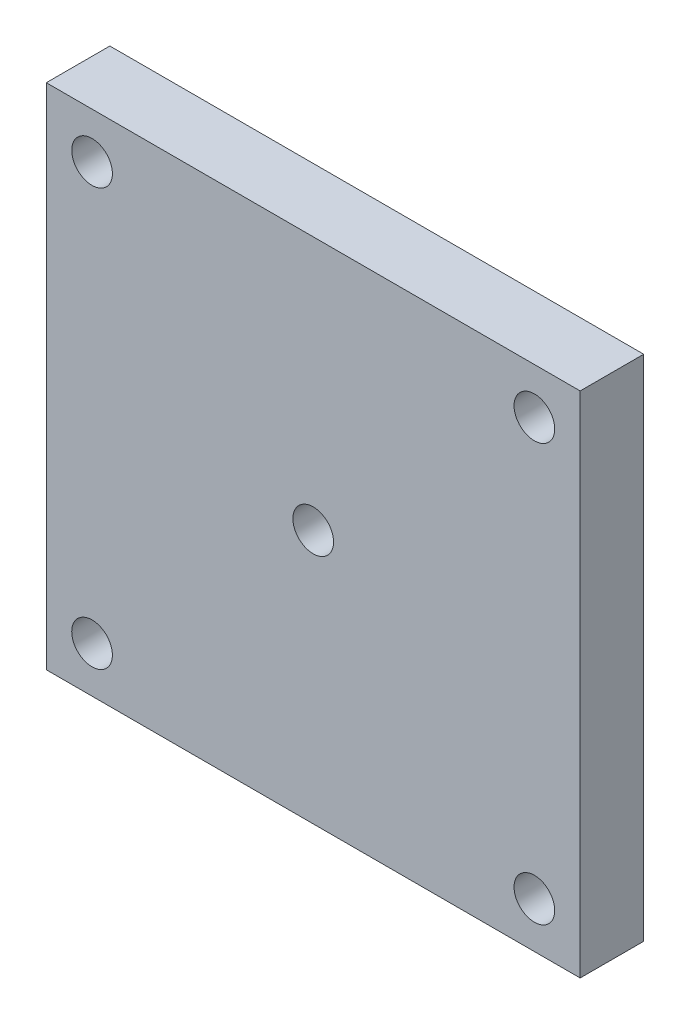
ISO-10303-21;
HEADER;
FILE_DESCRIPTION(('STEP AP214'),'2;1');
FILE_NAME('part.step','',(''),(''),'','','');
FILE_SCHEMA(('AUTOMOTIVE_DESIGN { 1 0 10303 214 1 1 1 1 }'));
ENDSEC;
DATA;
#1=APPLICATION_CONTEXT('core data for automotive mechanical design processes');
#2=APPLICATION_PROTOCOL_DEFINITION('international standard','automotive_design',2000,#1);
#3=PRODUCT_CONTEXT('',#1,'mechanical');
#4=PRODUCT('Part','Part','',(#3));
#5=PRODUCT_RELATED_PRODUCT_CATEGORY('part','',(#4));
#6=PRODUCT_DEFINITION_FORMATION('','',#4);
#7=PRODUCT_DEFINITION_CONTEXT('part definition',#1,'design');
#8=PRODUCT_DEFINITION('design','',#6,#7);
#9=PRODUCT_DEFINITION_SHAPE('','',#8);
#10=(LENGTH_UNIT() NAMED_UNIT(*) SI_UNIT(.MILLI.,.METRE.));
#11=(NAMED_UNIT(*) PLANE_ANGLE_UNIT() SI_UNIT($,.RADIAN.));
#12=(NAMED_UNIT(*) SI_UNIT($,.STERADIAN.) SOLID_ANGLE_UNIT());
#13=UNCERTAINTY_MEASURE_WITH_UNIT(LENGTH_MEASURE(1.E-05),#10,'distance_accuracy_value','');
#14=(GEOMETRIC_REPRESENTATION_CONTEXT(3) GLOBAL_UNCERTAINTY_ASSIGNED_CONTEXT((#13)) GLOBAL_UNIT_ASSIGNED_CONTEXT((#10,
#11,#12)) REPRESENTATION_CONTEXT('',''));
#15=CARTESIAN_POINT('',(0.,0.,0.));
#16=DIRECTION('',(0.,0.,1.));
#17=DIRECTION('',(1.,0.,0.));
#18=AXIS2_PLACEMENT_3D('',#15,#16,#17);
#19=CARTESIAN_POINT('',(-21.,20.,2.5));
#20=DIRECTION('',(1.,0.,0.));
#21=DIRECTION('',(0.,1.,0.));
#22=AXIS2_PLACEMENT_3D('',#19,#20,#21);
#23=PLANE('',#22);
#24=DIRECTION('',(0.,-1.,0.));
#25=VECTOR('',#24,1.);
#26=CARTESIAN_POINT('',(-21.,20.,-2.5));
#27=LINE('',#26,#25);
#28=CARTESIAN_POINT('',(-21.,20.,-2.5));
#29=VERTEX_POINT('',#28);
#30=CARTESIAN_POINT('',(-21.,-20.,-2.5));
#31=VERTEX_POINT('',#30);
#32=EDGE_CURVE('E96',#29,#31,#27,.T.);
#33=ORIENTED_EDGE('',*,*,#32,.T.);
#34=DIRECTION('',(0.,0.,-1.));
#35=VECTOR('',#34,1.);
#36=CARTESIAN_POINT('',(-21.,-20.,2.5));
#37=LINE('',#36,#35);
#38=CARTESIAN_POINT('',(-21.,-20.,2.5));
#39=VERTEX_POINT('',#38);
#40=EDGE_CURVE('E11',#39,#31,#37,.T.);
#41=ORIENTED_EDGE('',*,*,#40,.F.);
#42=DIRECTION('',(0.,-1.,0.));
#43=VECTOR('',#42,1.);
#44=CARTESIAN_POINT('',(-21.,20.,2.5));
#45=LINE('',#44,#43);
#46=CARTESIAN_POINT('',(-21.,20.,2.5));
#47=VERTEX_POINT('',#46);
#48=EDGE_CURVE('E84',#47,#39,#45,.T.);
#49=ORIENTED_EDGE('',*,*,#48,.F.);
#50=DIRECTION('',(0.,0.,-1.));
#51=VECTOR('',#50,1.);
#52=CARTESIAN_POINT('',(-21.,20.,2.5));
#53=LINE('',#52,#51);
#54=EDGE_CURVE('E92',#47,#29,#53,.T.);
#55=ORIENTED_EDGE('',*,*,#54,.T.);
#56=EDGE_LOOP('',(#33,#41,#49,#55));
#57=FACE_BOUND('',#56,.T.);
#58=ADVANCED_FACE('F33',(#57),#23,.F.);
#59=CARTESIAN_POINT('',(-21.,-20.,2.5));
#60=DIRECTION('',(0.,1.,0.));
#61=DIRECTION('',(0.,0.,1.));
#62=AXIS2_PLACEMENT_3D('',#59,#60,#61);
#63=PLANE('',#62);
#64=DIRECTION('',(1.,0.,0.));
#65=VECTOR('',#64,1.);
#66=CARTESIAN_POINT('',(-21.,-20.,-2.5));
#67=LINE('',#66,#65);
#68=CARTESIAN_POINT('',(21.,-20.,-2.5));
#69=VERTEX_POINT('',#68);
#70=EDGE_CURVE('E88',#31,#69,#67,.T.);
#71=ORIENTED_EDGE('',*,*,#70,.T.);
#72=DIRECTION('',(0.,0.,-1.));
#73=VECTOR('',#72,1.);
#74=CARTESIAN_POINT('',(21.,-20.,2.5));
#75=LINE('',#74,#73);
#76=CARTESIAN_POINT('',(21.,-20.,2.5));
#77=VERTEX_POINT('',#76);
#78=EDGE_CURVE('E41',#77,#69,#75,.T.);
#79=ORIENTED_EDGE('',*,*,#78,.F.);
#80=DIRECTION('',(1.,0.,0.));
#81=VECTOR('',#80,1.);
#82=CARTESIAN_POINT('',(-21.,-20.,2.5));
#83=LINE('',#82,#81);
#84=EDGE_CURVE('E79',#39,#77,#83,.T.);
#85=ORIENTED_EDGE('',*,*,#84,.F.);
#86=ORIENTED_EDGE('',*,*,#40,.T.);
#87=EDGE_LOOP('',(#71,#79,#85,#86));
#88=FACE_BOUND('',#87,.T.);
#89=ADVANCED_FACE('F87',(#88),#63,.F.);
#90=CARTESIAN_POINT('',(21.,20.,2.5));
#91=DIRECTION('',(-1.,0.,0.));
#92=DIRECTION('',(0.,-1.,0.));
#93=AXIS2_PLACEMENT_3D('',#90,#91,#92);
#94=PLANE('',#93);
#95=DIRECTION('',(0.,1.,0.));
#96=VECTOR('',#95,1.);
#97=CARTESIAN_POINT('',(21.,20.,-2.5));
#98=LINE('',#97,#96);
#99=CARTESIAN_POINT('',(21.,20.,-2.5));
#100=VERTEX_POINT('',#99);
#101=EDGE_CURVE('E66',#69,#100,#98,.T.);
#102=ORIENTED_EDGE('',*,*,#101,.T.);
#103=DIRECTION('',(0.,0.,-1.));
#104=VECTOR('',#103,1.);
#105=CARTESIAN_POINT('',(21.,20.,2.5));
#106=LINE('',#105,#104);
#107=CARTESIAN_POINT('',(21.,20.,2.5));
#108=VERTEX_POINT('',#107);
#109=EDGE_CURVE('E89',#108,#100,#106,.T.);
#110=ORIENTED_EDGE('',*,*,#109,.F.);
#111=DIRECTION('',(0.,1.,0.));
#112=VECTOR('',#111,1.);
#113=CARTESIAN_POINT('',(21.,20.,2.5));
#114=LINE('',#113,#112);
#115=EDGE_CURVE('E82',#77,#108,#114,.T.);
#116=ORIENTED_EDGE('',*,*,#115,.F.);
#117=ORIENTED_EDGE('',*,*,#78,.T.);
#118=EDGE_LOOP('',(#102,#110,#116,#117));
#119=FACE_BOUND('',#118,.T.);
#120=ADVANCED_FACE('F90',(#119),#94,.F.);
#121=CARTESIAN_POINT('',(-21.,20.,2.5));
#122=DIRECTION('',(0.,-1.,0.));
#123=DIRECTION('',(0.,0.,-1.));
#124=AXIS2_PLACEMENT_3D('',#121,#122,#123);
#125=PLANE('',#124);
#126=DIRECTION('',(-1.,0.,0.));
#127=VECTOR('',#126,1.);
#128=CARTESIAN_POINT('',(-21.,20.,-2.5));
#129=LINE('',#128,#127);
#130=EDGE_CURVE('E72',#100,#29,#129,.T.);
#131=ORIENTED_EDGE('',*,*,#130,.T.);
#132=ORIENTED_EDGE('',*,*,#54,.F.);
#133=DIRECTION('',(-1.,0.,0.));
#134=VECTOR('',#133,1.);
#135=CARTESIAN_POINT('',(-21.,20.,2.5));
#136=LINE('',#135,#134);
#137=EDGE_CURVE('E49',#108,#47,#136,.T.);
#138=ORIENTED_EDGE('',*,*,#137,.F.);
#139=ORIENTED_EDGE('',*,*,#109,.T.);
#140=EDGE_LOOP('',(#131,#132,#138,#139));
#141=FACE_BOUND('',#140,.T.);
#142=ADVANCED_FACE('F104',(#141),#125,.F.);
#143=CARTESIAN_POINT('',(0.,0.,2.5));
#144=DIRECTION('',(0.,0.,1.));
#145=DIRECTION('',(1.,0.,0.));
#146=AXIS2_PLACEMENT_3D('',#143,#144,#145);
#147=PLANE('',#146);
#148=CARTESIAN_POINT('',(17.4,16.4,2.5));
#149=DIRECTION('',(0.,0.,1.));
#150=DIRECTION('',(-1.,0.,0.));
#151=AXIS2_PLACEMENT_3D('',#148,#149,#150);
#152=CIRCLE('',#151,1.6);
#153=CARTESIAN_POINT('',(15.8,16.4,2.5));
#154=VERTEX_POINT('',#153);
#155=EDGE_CURVE('E134',#154,#154,#152,.T.);
#156=ORIENTED_EDGE('',*,*,#155,.F.);
#157=EDGE_LOOP('',(#156));
#158=FACE_BOUND('',#157,.T.);
#159=CARTESIAN_POINT('',(17.4,-16.4,2.5));
#160=DIRECTION('',(0.,0.,1.));
#161=DIRECTION('',(1.,0.,0.));
#162=AXIS2_PLACEMENT_3D('',#159,#160,#161);
#163=CIRCLE('',#162,1.6);
#164=CARTESIAN_POINT('',(19.,-16.4,2.5));
#165=VERTEX_POINT('',#164);
#166=EDGE_CURVE('E128',#165,#165,#163,.T.);
#167=ORIENTED_EDGE('',*,*,#166,.F.);
#168=EDGE_LOOP('',(#167));
#169=FACE_BOUND('',#168,.T.);
#170=CARTESIAN_POINT('',(-17.4,-16.4,2.5));
#171=DIRECTION('',(0.,0.,1.));
#172=DIRECTION('',(-1.,0.,0.));
#173=AXIS2_PLACEMENT_3D('',#170,#171,#172);
#174=CIRCLE('',#173,1.6);
#175=CARTESIAN_POINT('',(-19.,-16.4,2.5));
#176=VERTEX_POINT('',#175);
#177=EDGE_CURVE('E122',#176,#176,#174,.T.);
#178=ORIENTED_EDGE('',*,*,#177,.F.);
#179=EDGE_LOOP('',(#178));
#180=FACE_BOUND('',#179,.T.);
#181=CARTESIAN_POINT('',(0.,0.,2.5));
#182=DIRECTION('',(0.,0.,1.));
#183=DIRECTION('',(1.,0.,0.));
#184=AXIS2_PLACEMENT_3D('',#181,#182,#183);
#185=CIRCLE('',#184,1.6);
#186=CARTESIAN_POINT('',(1.6,0.,2.5));
#187=VERTEX_POINT('',#186);
#188=EDGE_CURVE('E116',#187,#187,#185,.T.);
#189=ORIENTED_EDGE('',*,*,#188,.F.);
#190=EDGE_LOOP('',(#189));
#191=FACE_BOUND('',#190,.T.);
#192=CARTESIAN_POINT('',(-17.4,16.4,2.5));
#193=DIRECTION('',(0.,0.,1.));
#194=DIRECTION('',(1.,0.,0.));
#195=AXIS2_PLACEMENT_3D('',#192,#193,#194);
#196=CIRCLE('',#195,1.6);
#197=CARTESIAN_POINT('',(-15.8,16.4,2.5));
#198=VERTEX_POINT('',#197);
#199=EDGE_CURVE('E110',#198,#198,#196,.T.);
#200=ORIENTED_EDGE('',*,*,#199,.F.);
#201=EDGE_LOOP('',(#200));
#202=FACE_BOUND('',#201,.T.);
#203=ORIENTED_EDGE('',*,*,#48,.T.);
#204=ORIENTED_EDGE('',*,*,#84,.T.);
#205=ORIENTED_EDGE('',*,*,#115,.T.);
#206=ORIENTED_EDGE('',*,*,#137,.T.);
#207=EDGE_LOOP('',(#203,#204,#205,#206));
#208=FACE_BOUND('',#207,.T.);
#209=ADVANCED_FACE('F80',(#158,#169,#180,#191,#202,#208),#147,.T.);
#210=CARTESIAN_POINT('',(0.,0.,-2.5));
#211=DIRECTION('',(0.,0.,1.));
#212=DIRECTION('',(1.,0.,0.));
#213=AXIS2_PLACEMENT_3D('',#210,#211,#212);
#214=PLANE('',#213);
#215=CARTESIAN_POINT('',(17.4,16.4,-2.5));
#216=DIRECTION('',(0.,0.,1.));
#217=DIRECTION('',(-1.,0.,0.));
#218=AXIS2_PLACEMENT_3D('',#215,#216,#217);
#219=CIRCLE('',#218,1.6);
#220=CARTESIAN_POINT('',(15.8,16.4,-2.5));
#221=VERTEX_POINT('',#220);
#222=EDGE_CURVE('E113',#221,#221,#219,.T.);
#223=ORIENTED_EDGE('',*,*,#222,.T.);
#224=EDGE_LOOP('',(#223));
#225=FACE_BOUND('',#224,.T.);
#226=CARTESIAN_POINT('',(17.4,-16.4,-2.5));
#227=DIRECTION('',(0.,0.,1.));
#228=DIRECTION('',(1.,0.,0.));
#229=AXIS2_PLACEMENT_3D('',#226,#227,#228);
#230=CIRCLE('',#229,1.6);
#231=CARTESIAN_POINT('',(19.,-16.4,-2.5));
#232=VERTEX_POINT('',#231);
#233=EDGE_CURVE('E131',#232,#232,#230,.T.);
#234=ORIENTED_EDGE('',*,*,#233,.T.);
#235=EDGE_LOOP('',(#234));
#236=FACE_BOUND('',#235,.T.);
#237=CARTESIAN_POINT('',(-17.4,-16.4,-2.5));
#238=DIRECTION('',(0.,0.,1.));
#239=DIRECTION('',(-1.,0.,0.));
#240=AXIS2_PLACEMENT_3D('',#237,#238,#239);
#241=CIRCLE('',#240,1.6);
#242=CARTESIAN_POINT('',(-19.,-16.4,-2.5));
#243=VERTEX_POINT('',#242);
#244=EDGE_CURVE('E125',#243,#243,#241,.T.);
#245=ORIENTED_EDGE('',*,*,#244,.T.);
#246=EDGE_LOOP('',(#245));
#247=FACE_BOUND('',#246,.T.);
#248=CARTESIAN_POINT('',(0.,0.,-2.5));
#249=DIRECTION('',(0.,0.,1.));
#250=DIRECTION('',(1.,0.,0.));
#251=AXIS2_PLACEMENT_3D('',#248,#249,#250);
#252=CIRCLE('',#251,1.6);
#253=CARTESIAN_POINT('',(1.6,0.,-2.5));
#254=VERTEX_POINT('',#253);
#255=EDGE_CURVE('E119',#254,#254,#252,.T.);
#256=ORIENTED_EDGE('',*,*,#255,.T.);
#257=EDGE_LOOP('',(#256));
#258=FACE_BOUND('',#257,.T.);
#259=CARTESIAN_POINT('',(-17.4,16.4,-2.5));
#260=DIRECTION('',(0.,0.,1.));
#261=DIRECTION('',(1.,0.,0.));
#262=AXIS2_PLACEMENT_3D('',#259,#260,#261);
#263=CIRCLE('',#262,1.6);
#264=CARTESIAN_POINT('',(-15.8,16.4,-2.5));
#265=VERTEX_POINT('',#264);
#266=EDGE_CURVE('E99',#265,#265,#263,.T.);
#267=ORIENTED_EDGE('',*,*,#266,.T.);
#268=EDGE_LOOP('',(#267));
#269=FACE_BOUND('',#268,.T.);
#270=ORIENTED_EDGE('',*,*,#32,.F.);
#271=ORIENTED_EDGE('',*,*,#130,.F.);
#272=ORIENTED_EDGE('',*,*,#101,.F.);
#273=ORIENTED_EDGE('',*,*,#70,.F.);
#274=EDGE_LOOP('',(#270,#271,#272,#273));
#275=FACE_BOUND('',#274,.T.);
#276=ADVANCED_FACE('F107',(#225,#236,#247,#258,#269,#275),#214,.F.);
#277=CARTESIAN_POINT('',(-17.4,16.4,-2.5));
#278=DIRECTION('',(0.,0.,1.));
#279=DIRECTION('',(1.,0.,0.));
#280=AXIS2_PLACEMENT_3D('',#277,#278,#279);
#281=CYLINDRICAL_SURFACE('',#280,1.6);
#282=ORIENTED_EDGE('',*,*,#266,.F.);
#283=EDGE_LOOP('',(#282));
#284=FACE_BOUND('',#283,.T.);
#285=ORIENTED_EDGE('',*,*,#199,.T.);
#286=EDGE_LOOP('',(#285));
#287=FACE_BOUND('',#286,.T.);
#288=ADVANCED_FACE('F160',(#284,#287),#281,.F.);
#289=CARTESIAN_POINT('',(0.,0.,-2.5));
#290=DIRECTION('',(0.,0.,1.));
#291=DIRECTION('',(1.,0.,0.));
#292=AXIS2_PLACEMENT_3D('',#289,#290,#291);
#293=CYLINDRICAL_SURFACE('',#292,1.6);
#294=ORIENTED_EDGE('',*,*,#255,.F.);
#295=EDGE_LOOP('',(#294));
#296=FACE_BOUND('',#295,.T.);
#297=ORIENTED_EDGE('',*,*,#188,.T.);
#298=EDGE_LOOP('',(#297));
#299=FACE_BOUND('',#298,.T.);
#300=ADVANCED_FACE('F162',(#296,#299),#293,.F.);
#301=CARTESIAN_POINT('',(-17.4,-16.4,-2.5));
#302=DIRECTION('',(0.,0.,1.));
#303=DIRECTION('',(1.,0.,0.));
#304=AXIS2_PLACEMENT_3D('',#301,#302,#303);
#305=CYLINDRICAL_SURFACE('',#304,1.6);
#306=ORIENTED_EDGE('',*,*,#244,.F.);
#307=EDGE_LOOP('',(#306));
#308=FACE_BOUND('',#307,.T.);
#309=ORIENTED_EDGE('',*,*,#177,.T.);
#310=EDGE_LOOP('',(#309));
#311=FACE_BOUND('',#310,.T.);
#312=ADVANCED_FACE('F169',(#308,#311),#305,.F.);
#313=CARTESIAN_POINT('',(17.4,-16.4,-2.5));
#314=DIRECTION('',(0.,0.,1.));
#315=DIRECTION('',(1.,0.,0.));
#316=AXIS2_PLACEMENT_3D('',#313,#314,#315);
#317=CYLINDRICAL_SURFACE('',#316,1.6);
#318=ORIENTED_EDGE('',*,*,#233,.F.);
#319=EDGE_LOOP('',(#318));
#320=FACE_BOUND('',#319,.T.);
#321=ORIENTED_EDGE('',*,*,#166,.T.);
#322=EDGE_LOOP('',(#321));
#323=FACE_BOUND('',#322,.T.);
#324=ADVANCED_FACE('F145',(#320,#323),#317,.F.);
#325=CARTESIAN_POINT('',(17.4,16.4,-2.5));
#326=DIRECTION('',(0.,0.,1.));
#327=DIRECTION('',(1.,0.,0.));
#328=AXIS2_PLACEMENT_3D('',#325,#326,#327);
#329=CYLINDRICAL_SURFACE('',#328,1.6);
#330=ORIENTED_EDGE('',*,*,#222,.F.);
#331=EDGE_LOOP('',(#330));
#332=FACE_BOUND('',#331,.T.);
#333=ORIENTED_EDGE('',*,*,#155,.T.);
#334=EDGE_LOOP('',(#333));
#335=FACE_BOUND('',#334,.T.);
#336=ADVANCED_FACE('F142',(#332,#335),#329,.F.);
#337=CLOSED_SHELL('',(#58,#89,#120,#142,#209,#276,#288,#300,#312,#324,#336));
#338=MANIFOLD_SOLID_BREP('B2',#337);
#339=ADVANCED_BREP_SHAPE_REPRESENTATION('',(#18,#338),#14);
#340=SHAPE_DEFINITION_REPRESENTATION(#9,#339);
ENDSEC;
END-ISO-10303-21;
